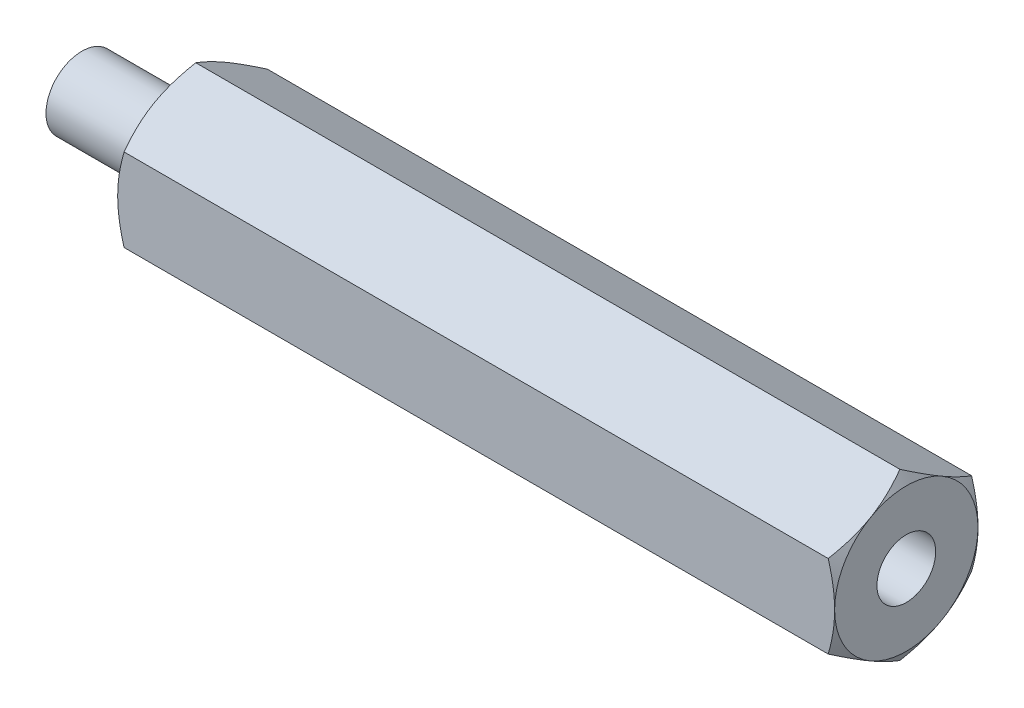
ISO-10303-21;
HEADER;
FILE_DESCRIPTION(('STEP AP214'),'2;1');
FILE_NAME('part.step','',(''),(''),'','','');
FILE_SCHEMA(('AUTOMOTIVE_DESIGN { 1 0 10303 214 1 1 1 1 }'));
ENDSEC;
DATA;
#1=APPLICATION_CONTEXT('core data for automotive mechanical design processes');
#2=APPLICATION_PROTOCOL_DEFINITION('international standard','automotive_design',2000,#1);
#3=PRODUCT_CONTEXT('',#1,'mechanical');
#4=PRODUCT('Part','Part','',(#3));
#5=PRODUCT_RELATED_PRODUCT_CATEGORY('part','',(#4));
#6=PRODUCT_DEFINITION_FORMATION('','',#4);
#7=PRODUCT_DEFINITION_CONTEXT('part definition',#1,'design');
#8=PRODUCT_DEFINITION('design','',#6,#7);
#9=PRODUCT_DEFINITION_SHAPE('','',#8);
#10=(LENGTH_UNIT() NAMED_UNIT(*) SI_UNIT(.MILLI.,.METRE.));
#11=(NAMED_UNIT(*) PLANE_ANGLE_UNIT() SI_UNIT($,.RADIAN.));
#12=(NAMED_UNIT(*) SI_UNIT($,.STERADIAN.) SOLID_ANGLE_UNIT());
#13=UNCERTAINTY_MEASURE_WITH_UNIT(LENGTH_MEASURE(1.E-05),#10,'distance_accuracy_value','');
#14=(GEOMETRIC_REPRESENTATION_CONTEXT(3) GLOBAL_UNCERTAINTY_ASSIGNED_CONTEXT((#13)) GLOBAL_UNIT_ASSIGNED_CONTEXT((#10,
#11,#12)) REPRESENTATION_CONTEXT('',''));
#15=CARTESIAN_POINT('',(0.,0.,0.));
#16=DIRECTION('',(0.,0.,1.));
#17=DIRECTION('',(1.,0.,0.));
#18=AXIS2_PLACEMENT_3D('',#15,#16,#17);
#19=CARTESIAN_POINT('',(0.,0.,0.));
#20=DIRECTION('',(1.,0.,0.));
#21=DIRECTION('',(0.,0.,-1.));
#22=AXIS2_PLACEMENT_3D('',#19,#20,#21);
#23=PLANE('',#22);
#24=CARTESIAN_POINT('',(0.,0.,0.));
#25=DIRECTION('',(1.,0.,0.));
#26=DIRECTION('',(0.,0.,-1.));
#27=AXIS2_PLACEMENT_3D('',#24,#25,#26);
#28=CIRCLE('',#27,3.);
#29=CARTESIAN_POINT('',(0.,0.,-3.));
#30=VERTEX_POINT('',#29);
#31=CARTESIAN_POINT('',(0.,2.59807621135331,-1.5));
#32=VERTEX_POINT('',#31);
#33=EDGE_CURVE('E264',#30,#32,#28,.T.);
#34=ORIENTED_EDGE('',*,*,#33,.F.);
#35=CARTESIAN_POINT('',(0.,-2.59807621135331,-1.5));
#36=VERTEX_POINT('',#35);
#37=EDGE_CURVE('E261',#36,#30,#28,.T.);
#38=ORIENTED_EDGE('',*,*,#37,.F.);
#39=CARTESIAN_POINT('',(0.,-2.59807621135331,1.5));
#40=VERTEX_POINT('',#39);
#41=EDGE_CURVE('E263',#40,#36,#28,.T.);
#42=ORIENTED_EDGE('',*,*,#41,.F.);
#43=CARTESIAN_POINT('',(0.,0.,3.));
#44=VERTEX_POINT('',#43);
#45=EDGE_CURVE('E327',#44,#40,#28,.T.);
#46=ORIENTED_EDGE('',*,*,#45,.F.);
#47=CARTESIAN_POINT('',(0.,0.,0.));
#48=DIRECTION('',(-1.,0.,0.));
#49=DIRECTION('',(0.,0.,1.));
#50=AXIS2_PLACEMENT_3D('',#47,#48,#49);
#51=CIRCLE('',#50,3.);
#52=CARTESIAN_POINT('',(0.,2.59807621135331,1.5));
#53=VERTEX_POINT('',#52);
#54=EDGE_CURVE('E300',#44,#53,#51,.T.);
#55=ORIENTED_EDGE('',*,*,#54,.T.);
#56=EDGE_CURVE('E269',#32,#53,#28,.T.);
#57=ORIENTED_EDGE('',*,*,#56,.F.);
#58=EDGE_LOOP('',(#34,#38,#42,#46,#55,#57));
#59=FACE_BOUND('',#58,.T.);
#60=CARTESIAN_POINT('',(0.,0.,0.));
#61=DIRECTION('',(1.,0.,0.));
#62=DIRECTION('',(0.,0.,-1.));
#63=AXIS2_PLACEMENT_3D('',#60,#61,#62);
#64=CIRCLE('',#63,1.15);
#65=CARTESIAN_POINT('',(0.,0.,-1.15));
#66=VERTEX_POINT('',#65);
#67=EDGE_CURVE('E11',#66,#66,#64,.F.);
#68=ORIENTED_EDGE('',*,*,#67,.F.);
#69=EDGE_LOOP('',(#68));
#70=FACE_BOUND('',#69,.T.);
#71=ADVANCED_FACE('F41',(#59,#70),#23,.F.);
#72=CARTESIAN_POINT('',(30.,-1.73205080756888,-2.99999999999999));
#73=DIRECTION('',(0.,0.,1.));
#74=DIRECTION('',(0.,-1.,0.));
#75=AXIS2_PLACEMENT_3D('',#72,#73,#74);
#76=PLANE('',#75);
#77=CARTESIAN_POINT('',(28.5644198840695,-4.59365399246918,-2.99999999999998));
#78=CARTESIAN_POINT('',(28.6280727969248,-4.46193702779006,-2.99999999999998));
#79=CARTESIAN_POINT('',(28.6910929471444,-4.32990864071463,-2.99999999999998));
#80=CARTESIAN_POINT('',(28.8155061399021,-4.06506063583465,-2.99999999999999));
#81=CARTESIAN_POINT('',(28.8768989007246,-3.93224088584945,-2.99999999999999));
#82=CARTESIAN_POINT('',(28.9980191527061,-3.66492428764749,-2.99999999999999));
#83=CARTESIAN_POINT('',(29.0577351037027,-3.53042219167021,-2.99999999999999));
#84=CARTESIAN_POINT('',(29.1746020609348,-3.26031251060446,-2.99999999999999));
#85=CARTESIAN_POINT('',(29.231753200869,-3.12470498357652,-2.99999999999999));
#86=CARTESIAN_POINT('',(29.3434870122042,-2.85048530058732,-2.99999999999999));
#87=CARTESIAN_POINT('',(29.3980295368381,-2.71185669617077,-2.99999999999999));
#88=CARTESIAN_POINT('',(29.5028428267804,-2.43296435096225,-2.99999999999999));
#89=CARTESIAN_POINT('',(29.5531131168251,-2.2927004302185,-2.99999999999999));
#90=CARTESIAN_POINT('',(29.6480311886768,-2.01060238690327,-2.99999999999999));
#91=CARTESIAN_POINT('',(29.6926909239121,-1.86877232784636,-2.99999999999999));
#92=CARTESIAN_POINT('',(29.7749374825916,-1.58309590976888,-2.99999999999999));
#93=CARTESIAN_POINT('',(29.8125265427424,-1.43925020389311,-2.99999999999999));
#94=CARTESIAN_POINT('',(29.8788069037845,-1.14944424523649,-2.99999999999999));
#95=CARTESIAN_POINT('',(29.9074958355326,-1.00348344023737,-2.99999999999999));
#96=CARTESIAN_POINT('',(29.9540443230582,-0.709802044404411,-3.));
#97=CARTESIAN_POINT('',(29.9719038692612,-0.562081452014827,-3.));
#98=CARTESIAN_POINT('',(29.9952136401379,-0.266588992220954,-3.));
#99=CARTESIAN_POINT('',(30.0007424255708,-0.118823483320505,-3.));
#100=CARTESIAN_POINT('',(29.9990969502189,0.176604064205604,-3.));
#101=CARTESIAN_POINT('',(29.9919259868885,0.324266119734157,-3.));
#102=CARTESIAN_POINT('',(29.9693409490398,0.576420476419139,-3.));
#103=CARTESIAN_POINT('',(29.9568680279671,0.681190963786365,-3.));
#104=CARTESIAN_POINT('',(29.92633994224,0.889922617976228,-3.));
#105=CARTESIAN_POINT('',(29.9082838972062,0.993883654507597,-3.));
#106=CARTESIAN_POINT('',(29.8466886967873,1.30446784089726,-3.));
#107=CARTESIAN_POINT('',(29.7957383351811,1.50963517896541,-3.));
#108=CARTESIAN_POINT('',(29.7078627305121,1.81663689760892,-3.));
#109=CARTESIAN_POINT('',(29.6762145436413,1.92007152271153,-3.));
#110=CARTESIAN_POINT('',(29.6097865648292,2.12586119326052,-3.));
#111=CARTESIAN_POINT('',(29.5750089328598,2.22821692967667,-3.));
#112=CARTESIAN_POINT('',(29.5030457256148,2.43142080387254,-3.));
#113=CARTESIAN_POINT('',(29.4658748056849,2.53227418460127,-3.));
#114=CARTESIAN_POINT('',(29.389351234657,2.73319845864684,-3.00000000000001));
#115=CARTESIAN_POINT('',(29.3499977017775,2.83326901679538,-3.00000000000001));
#116=CARTESIAN_POINT('',(29.3097682450937,2.93297774240011,-3.00000000000001));
#117=B_SPLINE_CURVE_WITH_KNOTS('',3,(#77,#78,#79,#80,#81,#82,#83,#84,#85,#86,#87,#88,#89,#90,
#91,#92,#93,#94,#95,#96,#97,#98,#99,#100,#101,#102,#103,#104,#105,#106,#107,#108,#109,#110,#111,
#112,#113,#114,#115,#116),.UNSPECIFIED.,.F.,.F.,(4,2,2,2,2,2,2,2,2,2,2,2,2,2,2,2,2,2,2,4),(0.,
0.438878844399202,0.877833172949451,1.31929945984492,1.7607427071362,2.20760550748113,
2.65451795408017,3.100461485232,3.54626371043603,3.99218450300883,4.43810568983109,
4.88117764390527,5.32413457244914,5.6405110561914,5.95693745348129,6.59026118519871,
6.91473961423265,7.23899577837221,7.56142681097225,7.88398906914349),.UNSPECIFIED.);
#118=CARTESIAN_POINT('',(29.7320508075689,-1.73205080756886,-3.00000000000001));
#119=VERTEX_POINT('',#118);
#120=CARTESIAN_POINT('',(30.,0.,-3.));
#121=VERTEX_POINT('',#120);
#122=EDGE_CURVE('E295',#119,#121,#117,.T.);
#123=ORIENTED_EDGE('',*,*,#122,.F.);
#124=DIRECTION('',(-1.,0.,0.));
#125=VECTOR('',#124,1.);
#126=CARTESIAN_POINT('',(30.,-1.73205080756888,-2.99999999999999));
#127=LINE('',#126,#125);
#128=CARTESIAN_POINT('',(0.26794919243113,-1.73205080756887,-3.00000000000001));
#129=VERTEX_POINT('',#128);
#130=EDGE_CURVE('E249',#119,#129,#127,.T.);
#131=ORIENTED_EDGE('',*,*,#130,.T.);
#132=CARTESIAN_POINT('',(1.43558011593049,-4.59365399246918,-2.99999999999998));
#133=CARTESIAN_POINT('',(1.37192720307518,-4.46193702779006,-2.99999999999998));
#134=CARTESIAN_POINT('',(1.30890705285555,-4.32990864071463,-2.99999999999998));
#135=CARTESIAN_POINT('',(1.18449386009788,-4.06506063583465,-2.99999999999999));
#136=CARTESIAN_POINT('',(1.12310109927543,-3.93224088584945,-2.99999999999999));
#137=CARTESIAN_POINT('',(1.00198084729392,-3.6649242876475,-2.99999999999999));
#138=CARTESIAN_POINT('',(0.942264896297282,-3.53042219167021,-2.99999999999999));
#139=CARTESIAN_POINT('',(0.825397939065226,-3.26031251060447,-2.99999999999999));
#140=CARTESIAN_POINT('',(0.768246799131018,-3.12470498357652,-2.99999999999999));
#141=CARTESIAN_POINT('',(0.656512987795773,-2.85048530058732,-2.99999999999999));
#142=CARTESIAN_POINT('',(0.601970463161886,-2.71185669617077,-2.99999999999999));
#143=CARTESIAN_POINT('',(0.497157173219566,-2.43296435096226,-2.99999999999999));
#144=CARTESIAN_POINT('',(0.446886883174878,-2.2927004302185,-2.99999999999999));
#145=CARTESIAN_POINT('',(0.351968811323161,-2.01060238690327,-2.99999999999999));
#146=CARTESIAN_POINT('',(0.307309076087878,-1.86877232784636,-2.99999999999999));
#147=CARTESIAN_POINT('',(0.225062517408379,-1.58309590976888,-2.99999999999999));
#148=CARTESIAN_POINT('',(0.187473457257564,-1.43925020389311,-2.99999999999999));
#149=CARTESIAN_POINT('',(0.121193096215531,-1.14944424523649,-2.99999999999999));
#150=CARTESIAN_POINT('',(0.0925041644674047,-1.00348344023737,-2.99999999999999));
#151=CARTESIAN_POINT('',(0.0459556769417573,-0.709802044404411,-3.));
#152=CARTESIAN_POINT('',(0.028096130738774,-0.562081452014826,-3.));
#153=CARTESIAN_POINT('',(0.0047863598620776,-0.266588992220953,-3.));
#154=CARTESIAN_POINT('',(-0.000742425570780135,-0.118823483320505,-3.));
#155=CARTESIAN_POINT('',(0.000903049781098387,0.176604064205605,-3.));
#156=CARTESIAN_POINT('',(0.00807401311151504,0.324266119734157,-3.));
#157=CARTESIAN_POINT('',(0.0306590509601958,0.57642047641914,-3.));
#158=CARTESIAN_POINT('',(0.0431319720329354,0.681190963786366,-3.));
#159=CARTESIAN_POINT('',(0.0736600577600225,0.889922617976228,-3.));
#160=CARTESIAN_POINT('',(0.0917161027938385,0.993883654507597,-3.));
#161=CARTESIAN_POINT('',(0.153311303212677,1.30446784089726,-3.));
#162=CARTESIAN_POINT('',(0.204261664818869,1.50963517896541,-3.));
#163=CARTESIAN_POINT('',(0.292137269487908,1.81663689760892,-3.));
#164=CARTESIAN_POINT('',(0.323785456358732,1.92007152271153,-3.));
#165=CARTESIAN_POINT('',(0.390213435170827,2.12586119326052,-3.));
#166=CARTESIAN_POINT('',(0.424991067140189,2.22821692967667,-3.));
#167=CARTESIAN_POINT('',(0.49695427438522,2.43142080387254,-3.));
#168=CARTESIAN_POINT('',(0.53412519431513,2.53227418460127,-3.));
#169=CARTESIAN_POINT('',(0.610648765343032,2.73319845864684,-3.00000000000001));
#170=CARTESIAN_POINT('',(0.650002298222532,2.83326901679538,-3.00000000000001));
#171=CARTESIAN_POINT('',(0.690231754906349,2.93297774240011,-3.00000000000001));
#172=B_SPLINE_CURVE_WITH_KNOTS('',3,(#132,#133,#134,#135,#136,#137,#138,#139,#140,#141,#142,
#143,#144,#145,#146,#147,#148,#149,#150,#151,#152,#153,#154,#155,#156,#157,#158,#159,#160,#161,
#162,#163,#164,#165,#166,#167,#168,#169,#170,#171),.UNSPECIFIED.,.F.,.F.,(4,2,2,2,2,2,2,2,2,2,2,
2,2,2,2,2,2,2,2,4),(0.,0.438878844399203,0.87783317294945,1.31929945984492,1.7607427071362,
2.20760550748112,2.65451795408017,3.100461485232,3.54626371043603,3.99218450300883,
4.43810568983109,4.88117764390527,5.32413457244914,5.6405110561914,5.95693745348129,
6.59026118519871,6.91473961423265,7.23899577837221,7.56142681097225,7.88398906914349),.UNSPECIFIED.);
#173=EDGE_CURVE('E332',#30,#129,#172,.F.);
#174=ORIENTED_EDGE('',*,*,#173,.F.);
#175=CARTESIAN_POINT('',(0.26794919243113,1.73205080756889,-3.));
#176=VERTEX_POINT('',#175);
#177=EDGE_CURVE('E329',#176,#30,#172,.F.);
#178=ORIENTED_EDGE('',*,*,#177,.F.);
#179=DIRECTION('',(-1.,0.,0.));
#180=VECTOR('',#179,1.);
#181=CARTESIAN_POINT('',(30.,1.73205080756888,-3.));
#182=LINE('',#181,#180);
#183=CARTESIAN_POINT('',(29.7320508075689,1.73205080756888,-3.));
#184=VERTEX_POINT('',#183);
#185=EDGE_CURVE('E259',#184,#176,#182,.T.);
#186=ORIENTED_EDGE('',*,*,#185,.F.);
#187=EDGE_CURVE('E211',#121,#184,#117,.T.);
#188=ORIENTED_EDGE('',*,*,#187,.F.);
#189=EDGE_LOOP('',(#123,#131,#174,#178,#186,#188));
#190=FACE_BOUND('',#189,.T.);
#191=ADVANCED_FACE('F43',(#190),#76,.F.);
#192=CARTESIAN_POINT('',(30.,1.73205080756888,-3.));
#193=DIRECTION('',(0.,-0.866025403784439,0.5));
#194=DIRECTION('',(0.,-0.5,-0.866025403784439));
#195=AXIS2_PLACEMENT_3D('',#192,#193,#194);
#196=PLANE('',#195);
#197=CARTESIAN_POINT('',(29.731984137569,1.73193533751504,-3.0002));
#198=CARTESIAN_POINT('',(29.7759462955477,1.80805042952749,-2.86836479341167));
#199=CARTESIAN_POINT('',(29.8159284137074,1.88482254163057,-2.73539159464475));
#200=CARTESIAN_POINT('',(29.8857179195545,2.03969618244676,-2.46714257999795));
#201=CARTESIAN_POINT('',(29.9155006177346,2.11780046324564,-2.33186199736566));
#202=CARTESIAN_POINT('',(29.9618621607887,2.27304105912605,-2.06297739790352));
#203=CARTESIAN_POINT('',(29.978749558877,2.35015348720802,-1.92941475457054));
#204=CARTESIAN_POINT('',(29.9989103575515,2.50474122256554,-1.66166094270431));
#205=CARTESIAN_POINT('',(30.0022004522189,2.58221596787772,-1.52747074752016));
#206=CARTESIAN_POINT('',(29.9953594691146,2.72698443778647,-1.27672440230419));
#207=CARTESIAN_POINT('',(29.9869080858074,2.79429982297458,-1.16013073502732));
#208=CARTESIAN_POINT('',(29.960121056993,2.92849202968484,-0.927703015025364));
#209=CARTESIAN_POINT('',(29.9417762591383,2.99536838698944,-0.811869766348669));
#210=CARTESIAN_POINT('',(29.8959152491467,3.12983731964849,-0.578962742943633));
#211=CARTESIAN_POINT('',(29.8682046147369,3.19741287398333,-0.461918449486061));
#212=CARTESIAN_POINT('',(29.8053122048626,3.33155605209905,-0.229575649500878));
#213=CARTESIAN_POINT('',(29.7701452089784,3.39812539473503,-0.114274165828897));
#214=CARTESIAN_POINT('',(29.731984137569,3.4642170851916,0.000199999999995969));
#215=B_SPLINE_CURVE_WITH_KNOTS('',3,(#197,#198,#199,#200,#201,#202,#203,#204,#205,#206,#207,
#208,#209,#210,#211,#212,#213,#214),.UNSPECIFIED.,.F.,.F.,(4,2,2,2,2,2,2,2,4),(0.,
0.475539830103041,0.952222784107967,1.41710776961288,1.88142182298026,2.28572436316091,
2.69040156475039,3.10405572063576,3.5168974940707),.UNSPECIFIED.);
#216=CARTESIAN_POINT('',(30.,2.59807621135331,-1.5));
#217=VERTEX_POINT('',#216);
#218=EDGE_CURVE('E209',#184,#217,#215,.T.);
#219=ORIENTED_EDGE('',*,*,#218,.F.);
#220=ORIENTED_EDGE('',*,*,#185,.T.);
#221=CARTESIAN_POINT('',(0.268015862431019,3.4642170851916,0.000199999999996036));
#222=CARTESIAN_POINT('',(0.224053704452314,3.38810199317915,-0.131635206588336));
#223=CARTESIAN_POINT('',(0.184071586292635,3.31132988107607,-0.264608405355254));
#224=CARTESIAN_POINT('',(0.114282080445472,3.15645624025988,-0.532857420002061));
#225=CARTESIAN_POINT('',(0.0844993822653864,3.078351959461,-0.668138002634347));
#226=CARTESIAN_POINT('',(0.0381378392112603,2.92311136358059,-0.93702260209649));
#227=CARTESIAN_POINT('',(0.0212504411229551,2.84599893549862,-1.07058524542947));
#228=CARTESIAN_POINT('',(0.0010896424485296,2.6914112001411,-1.3383390572957));
#229=CARTESIAN_POINT('',(-0.00220045221891359,2.61393645482892,-1.47252925247985));
#230=CARTESIAN_POINT('',(0.0046405308853968,2.46916798492017,-1.72327559769581));
#231=CARTESIAN_POINT('',(0.013091914192623,2.40185259973206,-1.83986926497268));
#232=CARTESIAN_POINT('',(0.0398789430070421,2.2676603930218,-2.07229698497464));
#233=CARTESIAN_POINT('',(0.0582237408617196,2.2007840357172,-2.18813023365134));
#234=CARTESIAN_POINT('',(0.104084750853335,2.06631510305815,-2.42103725705637));
#235=CARTESIAN_POINT('',(0.131795385263091,1.99873954872331,-2.53808155051395));
#236=CARTESIAN_POINT('',(0.194687795137409,1.8645963706076,-2.77042435049913));
#237=CARTESIAN_POINT('',(0.229854791021565,1.79802702797161,-2.88572583417111));
#238=CARTESIAN_POINT('',(0.26801586243102,1.73193533751504,-3.0002));
#239=B_SPLINE_CURVE_WITH_KNOTS('',3,(#221,#222,#223,#224,#225,#226,#227,#228,#229,#230,#231,
#232,#233,#234,#235,#236,#237,#238),.UNSPECIFIED.,.F.,.F.,(4,2,2,2,2,2,2,2,4),(0.,
0.475539830103042,0.952222784107968,1.41710776961289,1.88142182298026,2.28572436316091,
2.69040156475039,3.10405572063576,3.5168974940707),.UNSPECIFIED.);
#240=EDGE_CURVE('E225',#32,#176,#239,.T.);
#241=ORIENTED_EDGE('',*,*,#240,.F.);
#242=CARTESIAN_POINT('',(0.26794919243113,3.46410161513776,0.));
#243=VERTEX_POINT('',#242);
#244=EDGE_CURVE('E233',#243,#32,#239,.T.);
#245=ORIENTED_EDGE('',*,*,#244,.F.);
#246=DIRECTION('',(-1.,0.,0.));
#247=VECTOR('',#246,1.);
#248=CARTESIAN_POINT('',(30.,3.46410161513776,0.));
#249=LINE('',#248,#247);
#250=CARTESIAN_POINT('',(29.7320508075689,3.46410161513776,0.));
#251=VERTEX_POINT('',#250);
#252=EDGE_CURVE('E257',#251,#243,#249,.T.);
#253=ORIENTED_EDGE('',*,*,#252,.F.);
#254=EDGE_CURVE('E204',#217,#251,#215,.T.);
#255=ORIENTED_EDGE('',*,*,#254,.F.);
#256=EDGE_LOOP('',(#219,#220,#241,#245,#253,#255));
#257=FACE_BOUND('',#256,.T.);
#258=ADVANCED_FACE('F217',(#257),#196,.F.);
#259=CARTESIAN_POINT('',(30.,3.46410161513776,0.));
#260=DIRECTION('',(0.,-0.866025403784439,-0.5));
#261=DIRECTION('',(0.,0.5,-0.866025403784439));
#262=AXIS2_PLACEMENT_3D('',#259,#260,#261);
#263=PLANE('',#262);
#264=CARTESIAN_POINT('',(29.731984137569,3.4642170851916,-0.000200000000004011));
#265=CARTESIAN_POINT('',(29.7759462955477,3.38810199317915,0.131635206588327));
#266=CARTESIAN_POINT('',(29.8159284137074,3.31132988107607,0.264608405355245));
#267=CARTESIAN_POINT('',(29.8857179195545,3.15645624025988,0.532857420002053));
#268=CARTESIAN_POINT('',(29.9155006177346,3.078351959461,0.66813800263434));
#269=CARTESIAN_POINT('',(29.9618621607887,2.92311136358059,0.937022602096482));
#270=CARTESIAN_POINT('',(29.978749558877,2.84599893549862,1.07058524542946));
#271=CARTESIAN_POINT('',(29.9989103575515,2.6914112001411,1.33833905729569));
#272=CARTESIAN_POINT('',(30.0022004522189,2.61393645482892,1.47252925247984));
#273=CARTESIAN_POINT('',(29.9953594691146,2.46916798492017,1.72327559769581));
#274=CARTESIAN_POINT('',(29.9869080858074,2.40185259973206,1.83986926497268));
#275=CARTESIAN_POINT('',(29.960121056993,2.2676603930218,2.07229698497464));
#276=CARTESIAN_POINT('',(29.9417762591383,2.2007840357172,2.18813023365133));
#277=CARTESIAN_POINT('',(29.8959152491467,2.06631510305815,2.42103725705636));
#278=CARTESIAN_POINT('',(29.8682046147369,1.99873954872331,2.53808155051394));
#279=CARTESIAN_POINT('',(29.8053122048626,1.86459637060759,2.77042435049912));
#280=CARTESIAN_POINT('',(29.7701452089784,1.79802702797161,2.8857258341711));
#281=CARTESIAN_POINT('',(29.731984137569,1.73193533751504,3.0002));
#282=B_SPLINE_CURVE_WITH_KNOTS('',3,(#264,#265,#266,#267,#268,#269,#270,#271,#272,#273,#274,
#275,#276,#277,#278,#279,#280,#281),.UNSPECIFIED.,.F.,.F.,(4,2,2,2,2,2,2,2,4),(0.,
0.475539830103042,0.952222784107968,1.41710776961289,1.88142182298026,2.28572436316091,
2.69040156475039,3.10405572063576,3.5168974940707),.UNSPECIFIED.);
#283=CARTESIAN_POINT('',(30.,2.59807621135331,1.5));
#284=VERTEX_POINT('',#283);
#285=EDGE_CURVE('E210',#251,#284,#282,.T.);
#286=ORIENTED_EDGE('',*,*,#285,.F.);
#287=ORIENTED_EDGE('',*,*,#252,.T.);
#288=CARTESIAN_POINT('',(0.268015862431017,1.73193533751504,3.0002));
#289=CARTESIAN_POINT('',(0.224053704452312,1.80805042952749,2.86836479341166));
#290=CARTESIAN_POINT('',(0.184071586292633,1.88482254163057,2.73539159464475));
#291=CARTESIAN_POINT('',(0.11428208044547,2.03969618244676,2.46714257999794));
#292=CARTESIAN_POINT('',(0.084499382265384,2.11780046324564,2.33186199736565));
#293=CARTESIAN_POINT('',(0.0381378392112581,2.27304105912605,2.06297739790351));
#294=CARTESIAN_POINT('',(0.0212504411229531,2.35015348720802,1.92941475457053));
#295=CARTESIAN_POINT('',(0.00108964244852769,2.50474122256554,1.6616609427043));
#296=CARTESIAN_POINT('',(-0.0022004522189157,2.58221596787772,1.52747074752015));
#297=CARTESIAN_POINT('',(0.00464053088539455,2.72698443778647,1.27672440230419));
#298=CARTESIAN_POINT('',(0.0130919141926208,2.79429982297458,1.16013073502732));
#299=CARTESIAN_POINT('',(0.0398789430070402,2.92849202968484,0.927703015025357));
#300=CARTESIAN_POINT('',(0.0582237408617177,2.99536838698944,0.811869766348663));
#301=CARTESIAN_POINT('',(0.104084750853333,3.12983731964849,0.578962742943627));
#302=CARTESIAN_POINT('',(0.131795385263089,3.19741287398333,0.461918449486054));
#303=CARTESIAN_POINT('',(0.194687795137408,3.33155605209904,0.22957564950087));
#304=CARTESIAN_POINT('',(0.229854791021564,3.39812539473503,0.114274165828889));
#305=CARTESIAN_POINT('',(0.268015862431019,3.4642170851916,-0.00020000000000414));
#306=B_SPLINE_CURVE_WITH_KNOTS('',3,(#288,#289,#290,#291,#292,#293,#294,#295,#296,#297,#298,
#299,#300,#301,#302,#303,#304,#305),.UNSPECIFIED.,.F.,.F.,(4,2,2,2,2,2,2,2,4),(0.,
0.475539830103042,0.952222784107967,1.41710776961288,1.88142182298026,2.28572436316091,
2.69040156475039,3.10405572063576,3.5168974940707),.UNSPECIFIED.);
#307=EDGE_CURVE('E240',#53,#243,#306,.T.);
#308=ORIENTED_EDGE('',*,*,#307,.F.);
#309=CARTESIAN_POINT('',(0.26794919243113,1.73205080756889,3.));
#310=VERTEX_POINT('',#309);
#311=EDGE_CURVE('E247',#310,#53,#306,.T.);
#312=ORIENTED_EDGE('',*,*,#311,.F.);
#313=DIRECTION('',(-1.,0.,0.));
#314=VECTOR('',#313,1.);
#315=CARTESIAN_POINT('',(30.,1.73205080756888,3.));
#316=LINE('',#315,#314);
#317=CARTESIAN_POINT('',(29.7320508075689,1.73205080756889,3.));
#318=VERTEX_POINT('',#317);
#319=EDGE_CURVE('E255',#318,#310,#316,.T.);
#320=ORIENTED_EDGE('',*,*,#319,.F.);
#321=EDGE_CURVE('E197',#284,#318,#282,.T.);
#322=ORIENTED_EDGE('',*,*,#321,.F.);
#323=EDGE_LOOP('',(#286,#287,#308,#312,#320,#322));
#324=FACE_BOUND('',#323,.T.);
#325=ADVANCED_FACE('F220',(#324),#263,.F.);
#326=CARTESIAN_POINT('',(30.,1.73205080756888,3.));
#327=DIRECTION('',(0.,0.,-1.));
#328=DIRECTION('',(0.,1.,0.));
#329=AXIS2_PLACEMENT_3D('',#326,#327,#328);
#330=PLANE('',#329);
#331=CARTESIAN_POINT('',(28.5644193664475,-4.59365506327389,3.));
#332=CARTESIAN_POINT('',(28.6280723014504,-4.4619380619392,3.));
#333=CARTESIAN_POINT('',(28.6910924738047,-4.3299096381802,3.));
#334=CARTESIAN_POINT('',(28.8155057107137,-4.06506155981041,3.));
#335=CARTESIAN_POINT('',(28.8768984935529,-3.93224177301895,3.));
#336=CARTESIAN_POINT('',(28.9980187895789,-3.66492510058906,3.));
#337=CARTESIAN_POINT('',(29.0577347625987,-3.53042296718749,3.));
#338=CARTESIAN_POINT('',(29.1746017634717,-3.26031321099483,3.));
#339=CARTESIAN_POINT('',(29.2317529250238,-3.12470564626426,3.));
#340=CARTESIAN_POINT('',(29.3434867792231,-2.85048588685442,3.));
#341=CARTESIAN_POINT('',(29.3980293250916,-2.71185724371336,3.));
#342=CARTESIAN_POINT('',(29.5028426563253,-2.43296482040767,3.));
#343=CARTESIAN_POINT('',(29.5531129664264,-2.29270086029105,3.));
#344=CARTESIAN_POINT('',(29.6480310763942,-2.0106027374863,3.));
#345=CARTESIAN_POINT('',(29.6926908296956,-1.86877263831545,3.));
#346=CARTESIAN_POINT('',(29.7749374214504,-1.58309613890588,3.));
#347=CARTESIAN_POINT('',(29.8125264966123,-1.43925039181263,3.));
#348=CARTESIAN_POINT('',(29.8788068880238,-1.14944432791496,3.));
#349=CARTESIAN_POINT('',(29.9074958338073,-1.00348345858386,3.));
#350=CARTESIAN_POINT('',(29.9540443395923,-0.709801932641883,3.));
#351=CARTESIAN_POINT('',(29.9719038900262,-0.562081274476383,3.));
#352=CARTESIAN_POINT('',(29.9952136577863,-0.266588683448596,3.));
#353=CARTESIAN_POINT('',(30.0007424359685,-0.118823109094466,3.));
#354=CARTESIAN_POINT('',(29.9990969349384,0.176604568225086,3.));
#355=CARTESIAN_POINT('',(29.991925953178,0.324266688093674,3.));
#356=CARTESIAN_POINT('',(29.9693408784322,0.576421127047417,3.));
#357=CARTESIAN_POINT('',(29.9568679425915,0.681191633058703,3.));
#358=CARTESIAN_POINT('',(29.9263398265149,0.889923323753454,3.));
#359=CARTESIAN_POINT('',(29.9082837658996,0.993884378145526,3.));
#360=CARTESIAN_POINT('',(29.8466885183574,1.30446861725755,3.));
#361=CARTESIAN_POINT('',(29.7957381248618,1.50963598921607,3.));
#362=CARTESIAN_POINT('',(29.7078624730202,1.81663775851161,3.));
#363=CARTESIAN_POINT('',(29.6762142703115,1.92007240077832,3.));
#364=CARTESIAN_POINT('',(29.6097862602807,2.12586210546062,3.));
#365=CARTESIAN_POINT('',(29.5750086129306,2.22821785884627,3.));
#366=CARTESIAN_POINT('',(29.5030453755264,2.43142176673504,3.));
#367=CARTESIAN_POINT('',(29.4658744408176,2.53227516418831,2.99999999999999));
#368=CARTESIAN_POINT('',(29.389350840677,2.73319947171954,2.99999999999999));
#369=CARTESIAN_POINT('',(29.3499972934633,2.83327004662894,2.99999999999999));
#370=CARTESIAN_POINT('',(29.3097678226654,2.93297878902285,2.99999999999999));
#371=B_SPLINE_CURVE_WITH_KNOTS('',3,(#331,#332,#333,#334,#335,#336,#337,#338,#339,#340,#341,
#342,#343,#344,#345,#346,#347,#348,#349,#350,#351,#352,#353,#354,#355,#356,#357,#358,#359,#360,
#361,#362,#363,#364,#365,#366,#367,#368,#369,#370),.UNSPECIFIED.,.F.,.F.,(4,2,2,2,2,2,2,2,2,2,2,
2,2,2,2,2,2,2,2,4),(0.,0.438878972321586,0.877833428815442,1.31929984513467,1.76074322183933,
2.20760615360299,2.65451873166517,3.10046239380698,3.54626474989473,3.99218573952055,
4.43810712310574,4.88117927184297,5.32413639518723,5.64051293969399,5.95693939775843,
6.59026325136605,6.91474174356256,7.2389979707688,7.56142906579428,7.88399138651427),.UNSPECIFIED.);
#372=CARTESIAN_POINT('',(30.,0.,3.));
#373=VERTEX_POINT('',#372);
#374=EDGE_CURVE('E312',#318,#373,#371,.F.);
#375=ORIENTED_EDGE('',*,*,#374,.F.);
#376=ORIENTED_EDGE('',*,*,#319,.T.);
#377=CARTESIAN_POINT('',(1.43558063355251,-4.59365506327389,3.));
#378=CARTESIAN_POINT('',(1.37192769854956,-4.4619380619392,3.));
#379=CARTESIAN_POINT('',(1.30890752619532,-4.3299096381802,3.));
#380=CARTESIAN_POINT('',(1.18449428928629,-4.06506155981041,3.));
#381=CARTESIAN_POINT('',(1.12310150644713,-3.93224177301895,3.));
#382=CARTESIAN_POINT('',(1.00198121042109,-3.66492510058906,3.));
#383=CARTESIAN_POINT('',(0.942265237401328,-3.53042296718749,3.));
#384=CARTESIAN_POINT('',(0.825398236528276,-3.26031321099483,3.));
#385=CARTESIAN_POINT('',(0.768247074976154,-3.12470564626426,3.));
#386=CARTESIAN_POINT('',(0.656513220776875,-2.85048588685442,3.));
#387=CARTESIAN_POINT('',(0.601970674908437,-2.71185724371336,3.));
#388=CARTESIAN_POINT('',(0.497157343674698,-2.43296482040767,3.));
#389=CARTESIAN_POINT('',(0.44688703357356,-2.29270086029105,3.));
#390=CARTESIAN_POINT('',(0.35196892360579,-2.0106027374863,3.));
#391=CARTESIAN_POINT('',(0.307309170304396,-1.86877263831545,3.));
#392=CARTESIAN_POINT('',(0.225062578549619,-1.58309613890589,3.));
#393=CARTESIAN_POINT('',(0.187473503387646,-1.43925039181263,3.));
#394=CARTESIAN_POINT('',(0.121193111976202,-1.14944432791496,3.));
#395=CARTESIAN_POINT('',(0.0925041661926739,-1.00348345858387,3.));
#396=CARTESIAN_POINT('',(0.0459556604077361,-0.709801932641885,3.));
#397=CARTESIAN_POINT('',(0.0280961099738234,-0.562081274476384,3.));
#398=CARTESIAN_POINT('',(0.00478634221371127,-0.266588683448596,3.));
#399=CARTESIAN_POINT('',(-0.000742435968459603,-0.118823109094466,3.));
#400=CARTESIAN_POINT('',(0.000903065061580798,0.176604568225088,3.));
#401=CARTESIAN_POINT('',(0.00807404682195553,0.324266688093676,3.));
#402=CARTESIAN_POINT('',(0.0306591215677558,0.576421127047419,3.));
#403=CARTESIAN_POINT('',(0.0431320574085371,0.681191633058705,3.));
#404=CARTESIAN_POINT('',(0.0736601734850509,0.889923323753457,3.));
#405=CARTESIAN_POINT('',(0.0917162341003883,0.993884378145529,3.));
#406=CARTESIAN_POINT('',(0.153311481642569,1.30446861725755,3.));
#407=CARTESIAN_POINT('',(0.204261875138236,1.50963598921607,3.));
#408=CARTESIAN_POINT('',(0.292137526979836,1.81663775851162,3.));
#409=CARTESIAN_POINT('',(0.323785729688501,1.92007240077832,3.));
#410=CARTESIAN_POINT('',(0.390213739719326,2.12586210546063,3.));
#411=CARTESIAN_POINT('',(0.42499138706937,2.22821785884628,3.));
#412=CARTESIAN_POINT('',(0.496954624473555,2.43142176673504,3.));
#413=CARTESIAN_POINT('',(0.534125559182368,2.53227516418832,2.99999999999999));
#414=CARTESIAN_POINT('',(0.610649159322955,2.73319947171954,2.99999999999999));
#415=CARTESIAN_POINT('',(0.650002706536708,2.83327004662894,2.99999999999999));
#416=CARTESIAN_POINT('',(0.690232177334557,2.93297878902285,2.99999999999999));
#417=B_SPLINE_CURVE_WITH_KNOTS('',3,(#377,#378,#379,#380,#381,#382,#383,#384,#385,#386,#387,
#388,#389,#390,#391,#392,#393,#394,#395,#396,#397,#398,#399,#400,#401,#402,#403,#404,#405,#406,
#407,#408,#409,#410,#411,#412,#413,#414,#415,#416),.UNSPECIFIED.,.F.,.F.,(4,2,2,2,2,2,2,2,2,2,2,
2,2,2,2,2,2,2,2,4),(0.,0.438878972321589,0.877833428815445,1.31929984513467,1.76074322183934,
2.20760615360299,2.65451873166517,3.10046239380698,3.54626474989473,3.99218573952055,
4.43810712310574,4.88117927184297,5.32413639518723,5.64051293969399,5.95693939775844,
6.59026325136606,6.91474174356256,7.2389979707688,7.56142906579428,7.88399138651428),.UNSPECIFIED.);
#418=EDGE_CURVE('E248',#44,#310,#417,.T.);
#419=ORIENTED_EDGE('',*,*,#418,.F.);
#420=CARTESIAN_POINT('',(0.26794919243113,-1.73205080756886,3.00000000000001));
#421=VERTEX_POINT('',#420);
#422=EDGE_CURVE('E234',#421,#44,#417,.T.);
#423=ORIENTED_EDGE('',*,*,#422,.F.);
#424=DIRECTION('',(-1.,0.,0.));
#425=VECTOR('',#424,1.);
#426=CARTESIAN_POINT('',(30.,-1.73205080756887,3.));
#427=LINE('',#426,#425);
#428=CARTESIAN_POINT('',(29.7320508075689,-1.73205080756886,3.00000000000001));
#429=VERTEX_POINT('',#428);
#430=EDGE_CURVE('E253',#429,#421,#427,.T.);
#431=ORIENTED_EDGE('',*,*,#430,.F.);
#432=EDGE_CURVE('E190',#373,#429,#371,.F.);
#433=ORIENTED_EDGE('',*,*,#432,.F.);
#434=EDGE_LOOP('',(#375,#376,#419,#423,#431,#433));
#435=FACE_BOUND('',#434,.T.);
#436=ADVANCED_FACE('F316',(#435),#330,.F.);
#437=CARTESIAN_POINT('',(30.,-1.73205080756887,3.));
#438=DIRECTION('',(0.,0.866025403784438,-0.500000000000001));
#439=DIRECTION('',(0.,0.500000000000001,0.866025403784438));
#440=AXIS2_PLACEMENT_3D('',#437,#438,#439);
#441=PLANE('',#440);
#442=CARTESIAN_POINT('',(29.731984137569,-1.73193533751503,3.0002));
#443=CARTESIAN_POINT('',(29.7759462955477,-1.80805042952747,2.86836479341167));
#444=CARTESIAN_POINT('',(29.8159284137074,-1.88482254163056,2.73539159464475));
#445=CARTESIAN_POINT('',(29.8857179195545,-2.03969618244675,2.46714257999794));
#446=CARTESIAN_POINT('',(29.9155006177346,-2.11780046324563,2.33186199736566));
#447=CARTESIAN_POINT('',(29.9618621607887,-2.27304105912604,2.06297739790352));
#448=CARTESIAN_POINT('',(29.9787495588771,-2.35015348720801,1.92941475457054));
#449=CARTESIAN_POINT('',(29.9989103575515,-2.50474122256553,1.66166094270431));
#450=CARTESIAN_POINT('',(30.0022004522189,-2.58221596787771,1.52747074752016));
#451=CARTESIAN_POINT('',(29.9953594691146,-2.72698443778646,1.27672440230419));
#452=CARTESIAN_POINT('',(29.9869080858074,-2.79429982297456,1.16013073502732));
#453=CARTESIAN_POINT('',(29.960121056993,-2.92849202968483,0.927703015025364));
#454=CARTESIAN_POINT('',(29.9417762591383,-2.99536838698943,0.811869766348669));
#455=CARTESIAN_POINT('',(29.8959152491467,-3.12983731964848,0.578962742943632));
#456=CARTESIAN_POINT('',(29.8682046147369,-3.19741287398332,0.461918449486059));
#457=CARTESIAN_POINT('',(29.8053122048626,-3.33155605209904,0.229575649500875));
#458=CARTESIAN_POINT('',(29.7701452089784,-3.39812539473502,0.114274165828893));
#459=CARTESIAN_POINT('',(29.731984137569,-3.46421708519159,-0.000200000000000865));
#460=B_SPLINE_CURVE_WITH_KNOTS('',3,(#442,#443,#444,#445,#446,#447,#448,#449,#450,#451,#452,
#453,#454,#455,#456,#457,#458,#459),.UNSPECIFIED.,.F.,.F.,(4,2,2,2,2,2,2,2,4),(0.,
0.475539830103042,0.952222784107967,1.41710776961288,1.88142182298026,2.28572436316091,
2.69040156475039,3.10405572063577,3.51689749407071),.UNSPECIFIED.);
#461=CARTESIAN_POINT('',(30.,-2.59807621135331,1.5));
#462=VERTEX_POINT('',#461);
#463=EDGE_CURVE('E284',#429,#462,#460,.T.);
#464=ORIENTED_EDGE('',*,*,#463,.F.);
#465=ORIENTED_EDGE('',*,*,#430,.T.);
#466=CARTESIAN_POINT('',(0.268015862431015,-3.46421708519159,-0.000200000000001088));
#467=CARTESIAN_POINT('',(0.22405370445231,-3.38810199317914,0.131635206588331));
#468=CARTESIAN_POINT('',(0.184071586292631,-3.31132988107606,0.264608405355248));
#469=CARTESIAN_POINT('',(0.114282080445467,-3.15645624025987,0.532857420002054));
#470=CARTESIAN_POINT('',(0.0844993822653814,-3.07835195946099,0.66813800263434));
#471=CARTESIAN_POINT('',(0.0381378392112548,-2.92311136358058,0.937022602096482));
#472=CARTESIAN_POINT('',(0.0212504411229494,-2.84599893549861,1.07058524542946));
#473=CARTESIAN_POINT('',(0.00108964244852355,-2.69141120014109,1.33833905729569));
#474=CARTESIAN_POINT('',(-0.00220045221891981,-2.61393645482891,1.47252925247984));
#475=CARTESIAN_POINT('',(0.00464053088539006,-2.46916798492016,1.72327559769581));
#476=CARTESIAN_POINT('',(0.013091914192616,-2.40185259973205,1.83986926497267));
#477=CARTESIAN_POINT('',(0.039878943007035,-2.26766039302179,2.07229698497464));
#478=CARTESIAN_POINT('',(0.0582237408617126,-2.20078403571719,2.18813023365133));
#479=CARTESIAN_POINT('',(0.104084750853328,-2.06631510305814,2.42103725705637));
#480=CARTESIAN_POINT('',(0.131795385263084,-1.9987395487233,2.53808155051394));
#481=CARTESIAN_POINT('',(0.194687795137403,-1.86459637060758,2.77042435049912));
#482=CARTESIAN_POINT('',(0.229854791021559,-1.7980270279716,2.8857258341711));
#483=CARTESIAN_POINT('',(0.268015862431014,-1.73193533751503,3.0002));
#484=B_SPLINE_CURVE_WITH_KNOTS('',3,(#466,#467,#468,#469,#470,#471,#472,#473,#474,#475,#476,
#477,#478,#479,#480,#481,#482,#483),.UNSPECIFIED.,.F.,.F.,(4,2,2,2,2,2,2,2,4),(0.,
0.475539830103041,0.952222784107965,1.41710776961288,1.88142182298026,2.28572436316091,
2.69040156475039,3.10405572063577,3.51689749407071),.UNSPECIFIED.);
#485=EDGE_CURVE('E321',#40,#421,#484,.T.);
#486=ORIENTED_EDGE('',*,*,#485,.F.);
#487=CARTESIAN_POINT('',(0.26794919243113,-3.46410161513776,0.));
#488=VERTEX_POINT('',#487);
#489=EDGE_CURVE('E331',#488,#40,#484,.T.);
#490=ORIENTED_EDGE('',*,*,#489,.F.);
#491=DIRECTION('',(-1.,0.,0.));
#492=VECTOR('',#491,1.);
#493=CARTESIAN_POINT('',(30.,-3.46410161513775,0.));
#494=LINE('',#493,#492);
#495=CARTESIAN_POINT('',(29.7320508075689,-3.46410161513776,0.));
#496=VERTEX_POINT('',#495);
#497=EDGE_CURVE('E251',#496,#488,#494,.T.);
#498=ORIENTED_EDGE('',*,*,#497,.F.);
#499=EDGE_CURVE('E162',#462,#496,#460,.T.);
#500=ORIENTED_EDGE('',*,*,#499,.F.);
#501=EDGE_LOOP('',(#464,#465,#486,#490,#498,#500));
#502=FACE_BOUND('',#501,.T.);
#503=ADVANCED_FACE('F283',(#502),#441,.F.);
#504=CARTESIAN_POINT('',(30.,-3.46410161513775,0.));
#505=DIRECTION('',(0.,0.866025403784438,0.500000000000001));
#506=DIRECTION('',(0.,-0.500000000000001,0.866025403784438));
#507=AXIS2_PLACEMENT_3D('',#504,#505,#506);
#508=PLANE('',#507);
#509=CARTESIAN_POINT('',(29.731984137569,-3.46421708519159,0.000199999999999082));
#510=CARTESIAN_POINT('',(29.7759462955477,-3.38810199317915,-0.131635206588333));
#511=CARTESIAN_POINT('',(29.8159284137074,-3.31132988107606,-0.26460840535525));
#512=CARTESIAN_POINT('',(29.8857179195545,-3.15645624025987,-0.532857420002057));
#513=CARTESIAN_POINT('',(29.9155006177346,-3.07835195946099,-0.668138002634343));
#514=CARTESIAN_POINT('',(29.9618621607887,-2.92311136358058,-0.937022602096485));
#515=CARTESIAN_POINT('',(29.978749558877,-2.84599893549861,-1.07058524542946));
#516=CARTESIAN_POINT('',(29.9989103575515,-2.69141120014109,-1.33833905729569));
#517=CARTESIAN_POINT('',(30.0022004522189,-2.61393645482891,-1.47252925247984));
#518=CARTESIAN_POINT('',(29.9953594691146,-2.46916798492016,-1.72327559769581));
#519=CARTESIAN_POINT('',(29.9869080858074,-2.40185259973206,-1.83986926497268));
#520=CARTESIAN_POINT('',(29.960121056993,-2.26766039302179,-2.07229698497464));
#521=CARTESIAN_POINT('',(29.9417762591383,-2.2007840357172,-2.18813023365133));
#522=CARTESIAN_POINT('',(29.8959152491467,-2.06631510305814,-2.42103725705636));
#523=CARTESIAN_POINT('',(29.8682046147369,-1.9987395487233,-2.53808155051394));
#524=CARTESIAN_POINT('',(29.8053122048626,-1.86459637060759,-2.77042435049912));
#525=CARTESIAN_POINT('',(29.7701452089784,-1.79802702797161,-2.8857258341711));
#526=CARTESIAN_POINT('',(29.731984137569,-1.73193533751504,-3.00019999999999));
#527=B_SPLINE_CURVE_WITH_KNOTS('',3,(#509,#510,#511,#512,#513,#514,#515,#516,#517,#518,#519,
#520,#521,#522,#523,#524,#525,#526),.UNSPECIFIED.,.F.,.F.,(4,2,2,2,2,2,2,2,4),(0.,
0.475539830103042,0.952222784107966,1.41710776961288,1.88142182298026,2.28572436316091,
2.69040156475039,3.10405572063576,3.5168974940707),.UNSPECIFIED.);
#528=CARTESIAN_POINT('',(30.,-2.59807621135331,-1.5));
#529=VERTEX_POINT('',#528);
#530=EDGE_CURVE('E161',#496,#529,#527,.T.);
#531=ORIENTED_EDGE('',*,*,#530,.F.);
#532=ORIENTED_EDGE('',*,*,#497,.T.);
#533=CARTESIAN_POINT('',(0.268015862431013,-1.73193533751504,-3.00019999999999));
#534=CARTESIAN_POINT('',(0.224053704452308,-1.80805042952748,-2.86836479341166));
#535=CARTESIAN_POINT('',(0.18407158629263,-1.88482254163057,-2.73539159464474));
#536=CARTESIAN_POINT('',(0.114282080445466,-2.03969618244675,-2.46714257999794));
#537=CARTESIAN_POINT('',(0.0844993822653806,-2.11780046324563,-2.33186199736565));
#538=CARTESIAN_POINT('',(0.0381378392112545,-2.27304105912604,-2.06297739790351));
#539=CARTESIAN_POINT('',(0.0212504411229494,-2.35015348720802,-1.92941475457053));
#540=CARTESIAN_POINT('',(0.00108964244852412,-2.50474122256553,-1.6616609427043));
#541=CARTESIAN_POINT('',(-0.00220045221891897,-2.58221596787771,-1.52747074752015));
#542=CARTESIAN_POINT('',(0.00464053088539142,-2.72698443778646,-1.27672440230419));
#543=CARTESIAN_POINT('',(0.0130919141926176,-2.79429982297457,-1.16013073502732));
#544=CARTESIAN_POINT('',(0.0398789430070367,-2.92849202968483,-0.92770301502536));
#545=CARTESIAN_POINT('',(0.0582237408617142,-2.99536838698943,-0.811869766348666));
#546=CARTESIAN_POINT('',(0.10408475085333,-3.12983731964848,-0.57896274294363));
#547=CARTESIAN_POINT('',(0.131795385263085,-3.19741287398332,-0.461918449486058));
#548=CARTESIAN_POINT('',(0.194687795137404,-3.33155605209904,-0.229575649500875));
#549=CARTESIAN_POINT('',(0.22985479102156,-3.39812539473502,-0.114274165828894));
#550=CARTESIAN_POINT('',(0.268015862431015,-3.46421708519159,0.000199999999999006));
#551=B_SPLINE_CURVE_WITH_KNOTS('',3,(#533,#534,#535,#536,#537,#538,#539,#540,#541,#542,#543,
#544,#545,#546,#547,#548,#549,#550),.UNSPECIFIED.,.F.,.F.,(4,2,2,2,2,2,2,2,4),(0.,
0.475539830103041,0.952222784107965,1.41710776961288,1.88142182298026,2.28572436316091,
2.69040156475038,3.10405572063576,3.5168974940707),.UNSPECIFIED.);
#552=EDGE_CURVE('E302',#36,#488,#551,.T.);
#553=ORIENTED_EDGE('',*,*,#552,.F.);
#554=EDGE_CURVE('E338',#129,#36,#551,.T.);
#555=ORIENTED_EDGE('',*,*,#554,.F.);
#556=ORIENTED_EDGE('',*,*,#130,.F.);
#557=EDGE_CURVE('E147',#529,#119,#527,.T.);
#558=ORIENTED_EDGE('',*,*,#557,.F.);
#559=EDGE_LOOP('',(#531,#532,#553,#555,#556,#558));
#560=FACE_BOUND('',#559,.T.);
#561=ADVANCED_FACE('F169',(#560),#508,.F.);
#562=CARTESIAN_POINT('',(0.,0.,0.));
#563=DIRECTION('',(1.,0.,0.));
#564=DIRECTION('',(0.,0.,-1.));
#565=AXIS2_PLACEMENT_3D('',#562,#563,#564);
#566=CONICAL_SURFACE('',#565,3.,1.04719755119659);
#567=ORIENTED_EDGE('',*,*,#173,.T.);
#568=ORIENTED_EDGE('',*,*,#554,.T.);
#569=ORIENTED_EDGE('',*,*,#37,.T.);
#570=EDGE_LOOP('',(#567,#568,#569));
#571=FACE_BOUND('',#570,.T.);
#572=ADVANCED_FACE('F368',(#571),#566,.T.);
#573=ORIENTED_EDGE('',*,*,#489,.T.);
#574=ORIENTED_EDGE('',*,*,#41,.T.);
#575=ORIENTED_EDGE('',*,*,#552,.T.);
#576=EDGE_LOOP('',(#573,#574,#575));
#577=FACE_BOUND('',#576,.T.);
#578=ADVANCED_FACE('F349',(#577),#566,.T.);
#579=ORIENTED_EDGE('',*,*,#422,.T.);
#580=ORIENTED_EDGE('',*,*,#45,.T.);
#581=ORIENTED_EDGE('',*,*,#485,.T.);
#582=EDGE_LOOP('',(#579,#580,#581));
#583=FACE_BOUND('',#582,.T.);
#584=ADVANCED_FACE('F324',(#583),#566,.T.);
#585=ORIENTED_EDGE('',*,*,#311,.T.);
#586=ORIENTED_EDGE('',*,*,#54,.F.);
#587=ORIENTED_EDGE('',*,*,#418,.T.);
#588=EDGE_LOOP('',(#585,#586,#587));
#589=FACE_BOUND('',#588,.T.);
#590=ADVANCED_FACE('F181',(#589),#566,.T.);
#591=ORIENTED_EDGE('',*,*,#307,.T.);
#592=ORIENTED_EDGE('',*,*,#244,.T.);
#593=ORIENTED_EDGE('',*,*,#56,.T.);
#594=EDGE_LOOP('',(#591,#592,#593));
#595=FACE_BOUND('',#594,.T.);
#596=ADVANCED_FACE('F354',(#595),#566,.T.);
#597=ORIENTED_EDGE('',*,*,#240,.T.);
#598=ORIENTED_EDGE('',*,*,#177,.T.);
#599=ORIENTED_EDGE('',*,*,#33,.T.);
#600=EDGE_LOOP('',(#597,#598,#599));
#601=FACE_BOUND('',#600,.T.);
#602=ADVANCED_FACE('F177',(#601),#566,.T.);
#603=CARTESIAN_POINT('',(29.7320508075689,0.,0.));
#604=DIRECTION('',(-1.,0.,0.));
#605=DIRECTION('',(0.,0.,1.));
#606=AXIS2_PLACEMENT_3D('',#603,#604,#605);
#607=CONICAL_SURFACE('',#606,3.46410161513776,1.04719755119659);
#608=ORIENTED_EDGE('',*,*,#122,.T.);
#609=CARTESIAN_POINT('',(30.,0.,0.));
#610=DIRECTION('',(1.,0.,0.));
#611=DIRECTION('',(0.,0.,-1.));
#612=AXIS2_PLACEMENT_3D('',#609,#610,#611);
#613=CIRCLE('',#612,3.);
#614=EDGE_CURVE('E265',#529,#121,#613,.T.);
#615=ORIENTED_EDGE('',*,*,#614,.F.);
#616=ORIENTED_EDGE('',*,*,#557,.T.);
#617=EDGE_LOOP('',(#608,#615,#616));
#618=FACE_BOUND('',#617,.T.);
#619=ADVANCED_FACE('F172',(#618),#607,.T.);
#620=ORIENTED_EDGE('',*,*,#499,.T.);
#621=ORIENTED_EDGE('',*,*,#530,.T.);
#622=EDGE_CURVE('E64',#462,#529,#613,.T.);
#623=ORIENTED_EDGE('',*,*,#622,.F.);
#624=EDGE_LOOP('',(#620,#621,#623));
#625=FACE_BOUND('',#624,.T.);
#626=ADVANCED_FACE('F176',(#625),#607,.T.);
#627=ORIENTED_EDGE('',*,*,#432,.T.);
#628=ORIENTED_EDGE('',*,*,#463,.T.);
#629=EDGE_CURVE('E267',#373,#462,#613,.T.);
#630=ORIENTED_EDGE('',*,*,#629,.F.);
#631=EDGE_LOOP('',(#627,#628,#630));
#632=FACE_BOUND('',#631,.T.);
#633=ADVANCED_FACE('F315',(#632),#607,.T.);
#634=ORIENTED_EDGE('',*,*,#321,.T.);
#635=ORIENTED_EDGE('',*,*,#374,.T.);
#636=CARTESIAN_POINT('',(30.,0.,0.));
#637=DIRECTION('',(-1.,0.,0.));
#638=DIRECTION('',(0.,0.,1.));
#639=AXIS2_PLACEMENT_3D('',#636,#637,#638);
#640=CIRCLE('',#639,3.);
#641=EDGE_CURVE('E143',#373,#284,#640,.T.);
#642=ORIENTED_EDGE('',*,*,#641,.T.);
#643=EDGE_LOOP('',(#634,#635,#642));
#644=FACE_BOUND('',#643,.T.);
#645=ADVANCED_FACE('F310',(#644),#607,.T.);
#646=ORIENTED_EDGE('',*,*,#254,.T.);
#647=ORIENTED_EDGE('',*,*,#285,.T.);
#648=EDGE_CURVE('E270',#217,#284,#613,.T.);
#649=ORIENTED_EDGE('',*,*,#648,.F.);
#650=EDGE_LOOP('',(#646,#647,#649));
#651=FACE_BOUND('',#650,.T.);
#652=ADVANCED_FACE('F305',(#651),#607,.T.);
#653=ORIENTED_EDGE('',*,*,#187,.T.);
#654=ORIENTED_EDGE('',*,*,#218,.T.);
#655=EDGE_CURVE('E50',#121,#217,#613,.T.);
#656=ORIENTED_EDGE('',*,*,#655,.F.);
#657=EDGE_LOOP('',(#653,#654,#656));
#658=FACE_BOUND('',#657,.T.);
#659=ADVANCED_FACE('F179',(#658),#607,.T.);
#660=CARTESIAN_POINT('',(30.,0.,0.));
#661=DIRECTION('',(1.,0.,0.));
#662=DIRECTION('',(0.,0.,-1.));
#663=AXIS2_PLACEMENT_3D('',#660,#661,#662);
#664=PLANE('',#663);
#665=CARTESIAN_POINT('',(30.,0.,0.));
#666=DIRECTION('',(1.,0.,0.));
#667=DIRECTION('',(0.,0.,-1.));
#668=AXIS2_PLACEMENT_3D('',#665,#666,#667);
#669=CIRCLE('',#668,1.22949999999999);
#670=CARTESIAN_POINT('',(30.,0.,-1.22949999999999));
#671=VERTEX_POINT('',#670);
#672=EDGE_CURVE('E144',#671,#671,#669,.T.);
#673=ORIENTED_EDGE('',*,*,#672,.F.);
#674=EDGE_LOOP('',(#673));
#675=FACE_BOUND('',#674,.T.);
#676=ORIENTED_EDGE('',*,*,#614,.T.);
#677=ORIENTED_EDGE('',*,*,#655,.T.);
#678=ORIENTED_EDGE('',*,*,#648,.T.);
#679=ORIENTED_EDGE('',*,*,#641,.F.);
#680=ORIENTED_EDGE('',*,*,#629,.T.);
#681=ORIENTED_EDGE('',*,*,#622,.T.);
#682=EDGE_LOOP('',(#676,#677,#678,#679,#680,#681));
#683=FACE_BOUND('',#682,.T.);
#684=ADVANCED_FACE('F137',(#675,#683),#664,.T.);
#685=CARTESIAN_POINT('',(21.5,0.,0.));
#686=DIRECTION('',(1.,0.,0.));
#687=DIRECTION('',(0.,0.,-1.));
#688=AXIS2_PLACEMENT_3D('',#685,#686,#687);
#689=CONICAL_SURFACE('',#688,1.2295,1.02974425867665);
#690=CARTESIAN_POINT('',(20.7612418689056,0.,0.));
#691=VERTEX_POINT('',#690);
#692=VERTEX_LOOP('',#691);
#693=FACE_BOUND('',#692,.T.);
#694=CARTESIAN_POINT('',(21.5,0.,0.));
#695=DIRECTION('',(1.,0.,0.));
#696=DIRECTION('',(0.,0.,-1.));
#697=AXIS2_PLACEMENT_3D('',#694,#695,#696);
#698=CIRCLE('',#697,1.2295);
#699=CARTESIAN_POINT('',(21.5,0.,-1.2295));
#700=VERTEX_POINT('',#699);
#701=EDGE_CURVE('E141',#700,#700,#698,.T.);
#702=ORIENTED_EDGE('',*,*,#701,.T.);
#703=EDGE_LOOP('',(#702));
#704=FACE_BOUND('',#703,.T.);
#705=ADVANCED_FACE('F133',(#693,#704),#689,.F.);
#706=CARTESIAN_POINT('',(30.,0.,0.));
#707=DIRECTION('',(1.,0.,0.));
#708=DIRECTION('',(0.,0.,-1.));
#709=AXIS2_PLACEMENT_3D('',#706,#707,#708);
#710=CYLINDRICAL_SURFACE('',#709,1.22949999999999);
#711=ORIENTED_EDGE('',*,*,#701,.F.);
#712=EDGE_LOOP('',(#711));
#713=FACE_BOUND('',#712,.T.);
#714=ORIENTED_EDGE('',*,*,#672,.T.);
#715=EDGE_LOOP('',(#714));
#716=FACE_BOUND('',#715,.T.);
#717=ADVANCED_FACE('F136',(#713,#716),#710,.F.);
#718=CARTESIAN_POINT('',(-88.99,0.,0.));
#719=DIRECTION('',(-1.,0.,0.));
#720=DIRECTION('',(0.,0.,1.));
#721=AXIS2_PLACEMENT_3D('',#718,#719,#720);
#722=CYLINDRICAL_SURFACE('',#721,1.15);
#723=CARTESIAN_POINT('',(-1.,0.,0.));
#724=DIRECTION('',(-1.,0.,0.));
#725=DIRECTION('',(0.,0.,1.));
#726=AXIS2_PLACEMENT_3D('',#723,#724,#725);
#727=CIRCLE('',#726,1.15);
#728=CARTESIAN_POINT('',(-1.,0.,1.15));
#729=VERTEX_POINT('',#728);
#730=EDGE_CURVE('E150',#729,#729,#727,.T.);
#731=ORIENTED_EDGE('',*,*,#730,.F.);
#732=EDGE_LOOP('',(#731));
#733=FACE_BOUND('',#732,.T.);
#734=ORIENTED_EDGE('',*,*,#67,.T.);
#735=EDGE_LOOP('',(#734));
#736=FACE_BOUND('',#735,.T.);
#737=ADVANCED_FACE('F382',(#733,#736),#722,.T.);
#738=CARTESIAN_POINT('',(-1.,1.15,0.));
#739=DIRECTION('',(-1.,0.,0.));
#740=DIRECTION('',(0.,0.,1.));
#741=AXIS2_PLACEMENT_3D('',#738,#739,#740);
#742=PLANE('',#741);
#743=CARTESIAN_POINT('',(-1.,0.,0.));
#744=DIRECTION('',(-1.,0.,0.));
#745=DIRECTION('',(0.,0.,1.));
#746=AXIS2_PLACEMENT_3D('',#743,#744,#745);
#747=CIRCLE('',#746,1.5);
#748=CARTESIAN_POINT('',(-1.,0.,1.5));
#749=VERTEX_POINT('',#748);
#750=EDGE_CURVE('E405',#749,#749,#747,.T.);
#751=ORIENTED_EDGE('',*,*,#750,.F.);
#752=EDGE_LOOP('',(#751));
#753=FACE_BOUND('',#752,.T.);
#754=ORIENTED_EDGE('',*,*,#730,.T.);
#755=EDGE_LOOP('',(#754));
#756=FACE_BOUND('',#755,.T.);
#757=ADVANCED_FACE('F386',(#753,#756),#742,.F.);
#758=CARTESIAN_POINT('',(-88.99,0.,0.));
#759=DIRECTION('',(-1.,0.,0.));
#760=DIRECTION('',(0.,0.,1.));
#761=AXIS2_PLACEMENT_3D('',#758,#759,#760);
#762=CYLINDRICAL_SURFACE('',#761,1.5);
#763=CARTESIAN_POINT('',(-4.5,0.,0.));
#764=DIRECTION('',(-1.,0.,0.));
#765=DIRECTION('',(0.,0.,1.));
#766=AXIS2_PLACEMENT_3D('',#763,#764,#765);
#767=CIRCLE('',#766,1.5);
#768=CARTESIAN_POINT('',(-4.5,0.,1.5));
#769=VERTEX_POINT('',#768);
#770=EDGE_CURVE('E404',#769,#769,#767,.T.);
#771=ORIENTED_EDGE('',*,*,#770,.F.);
#772=EDGE_LOOP('',(#771));
#773=FACE_BOUND('',#772,.T.);
#774=ORIENTED_EDGE('',*,*,#750,.T.);
#775=EDGE_LOOP('',(#774));
#776=FACE_BOUND('',#775,.T.);
#777=ADVANCED_FACE('F392',(#773,#776),#762,.T.);
#778=CARTESIAN_POINT('',(-4.5,1.5,0.));
#779=DIRECTION('',(1.,0.,0.));
#780=DIRECTION('',(0.,0.,-1.));
#781=AXIS2_PLACEMENT_3D('',#778,#779,#780);
#782=PLANE('',#781);
#783=ORIENTED_EDGE('',*,*,#770,.T.);
#784=EDGE_LOOP('',(#783));
#785=FACE_BOUND('',#784,.T.);
#786=ADVANCED_FACE('F396',(#785),#782,.F.);
#787=CLOSED_SHELL('',(#71,#191,#258,#325,#436,#503,#561,#572,#578,#584,#590,#596,#602,#619,#626,
#633,#645,#652,#659,#684,#705,#717,#737,#757,#777,#786));
#788=MANIFOLD_SOLID_BREP('B2',#787);
#789=ADVANCED_BREP_SHAPE_REPRESENTATION('',(#18,#788),#14);
#790=SHAPE_DEFINITION_REPRESENTATION(#9,#789);
ENDSEC;
END-ISO-10303-21;
